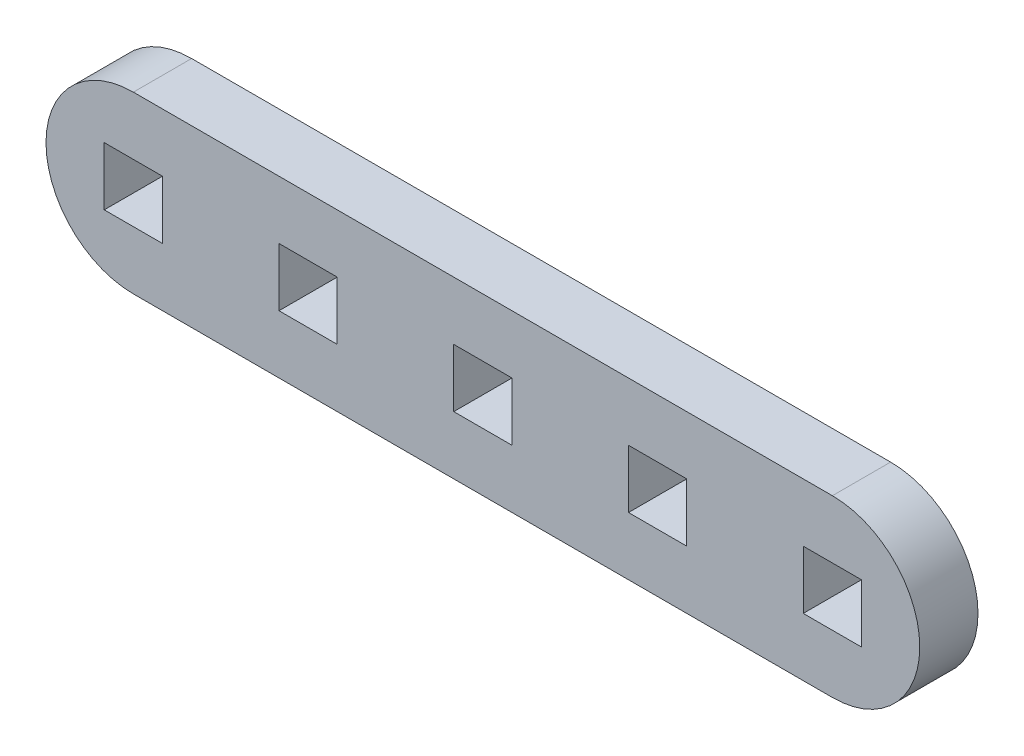
ISO-10303-21;
HEADER;
FILE_DESCRIPTION(('STEP AP214'),'2;1');
FILE_NAME('part.step','',(''),(''),'','','');
FILE_SCHEMA(('AUTOMOTIVE_DESIGN { 1 0 10303 214 1 1 1 1 }'));
ENDSEC;
DATA;
#1=APPLICATION_CONTEXT('core data for automotive mechanical design processes');
#2=APPLICATION_PROTOCOL_DEFINITION('international standard','automotive_design',2000,#1);
#3=PRODUCT_CONTEXT('',#1,'mechanical');
#4=PRODUCT('Part','Part','',(#3));
#5=PRODUCT_RELATED_PRODUCT_CATEGORY('part','',(#4));
#6=PRODUCT_DEFINITION_FORMATION('','',#4);
#7=PRODUCT_DEFINITION_CONTEXT('part definition',#1,'design');
#8=PRODUCT_DEFINITION('design','',#6,#7);
#9=PRODUCT_DEFINITION_SHAPE('','',#8);
#10=(LENGTH_UNIT() NAMED_UNIT(*) SI_UNIT(.MILLI.,.METRE.));
#11=(NAMED_UNIT(*) PLANE_ANGLE_UNIT() SI_UNIT($,.RADIAN.));
#12=(NAMED_UNIT(*) SI_UNIT($,.STERADIAN.) SOLID_ANGLE_UNIT());
#13=UNCERTAINTY_MEASURE_WITH_UNIT(LENGTH_MEASURE(1.E-05),#10,'distance_accuracy_value','');
#14=(GEOMETRIC_REPRESENTATION_CONTEXT(3) GLOBAL_UNCERTAINTY_ASSIGNED_CONTEXT((#13)) GLOBAL_UNIT_ASSIGNED_CONTEXT((#10,
#11,#12)) REPRESENTATION_CONTEXT('',''));
#15=CARTESIAN_POINT('',(0.,0.,0.));
#16=DIRECTION('',(0.,0.,1.));
#17=DIRECTION('',(1.,0.,0.));
#18=AXIS2_PLACEMENT_3D('',#15,#16,#17);
#19=CARTESIAN_POINT('',(47.4127492026,292.7399229362,3.));
#20=DIRECTION('',(0.,0.,1.));
#21=DIRECTION('',(1.,0.,0.));
#22=AXIS2_PLACEMENT_3D('',#19,#20,#21);
#23=PLANE('',#22);
#24=DIRECTION('',(0.,-1.,0.));
#25=VECTOR('',#24,1.);
#26=CARTESIAN_POINT('',(36.9127492026,294.2399229362,3.));
#27=LINE('',#26,#25);
#28=CARTESIAN_POINT('',(36.9127492026,294.2399229362,3.));
#29=VERTEX_POINT('',#28);
#30=CARTESIAN_POINT('',(36.9127492026,291.2399229362,3.));
#31=VERTEX_POINT('',#30);
#32=EDGE_CURVE('E232',#29,#31,#27,.T.);
#33=ORIENTED_EDGE('',*,*,#32,.F.);
#34=DIRECTION('',(-1.,0.,0.));
#35=VECTOR('',#34,1.);
#36=CARTESIAN_POINT('',(39.9127492026,294.2399229362,3.));
#37=LINE('',#36,#35);
#38=CARTESIAN_POINT('',(39.9127492026,294.2399229362,3.));
#39=VERTEX_POINT('',#38);
#40=EDGE_CURVE('E230',#39,#29,#37,.T.);
#41=ORIENTED_EDGE('',*,*,#40,.F.);
#42=DIRECTION('',(0.,1.,0.));
#43=VECTOR('',#42,1.);
#44=CARTESIAN_POINT('',(39.9127492026,291.2399229362,3.));
#45=LINE('',#44,#43);
#46=CARTESIAN_POINT('',(39.9127492026,291.2399229362,3.));
#47=VERTEX_POINT('',#46);
#48=EDGE_CURVE('E238',#47,#39,#45,.T.);
#49=ORIENTED_EDGE('',*,*,#48,.F.);
#50=DIRECTION('',(1.,0.,0.));
#51=VECTOR('',#50,1.);
#52=CARTESIAN_POINT('',(36.9127492026,291.2399229362,3.));
#53=LINE('',#52,#51);
#54=EDGE_CURVE('E235',#31,#47,#53,.T.);
#55=ORIENTED_EDGE('',*,*,#54,.F.);
#56=EDGE_LOOP('',(#33,#41,#49,#55));
#57=FACE_BOUND('',#56,.T.);
#58=DIRECTION('',(0.,-1.,0.));
#59=VECTOR('',#58,1.);
#60=CARTESIAN_POINT('',(18.9127492026,294.2399229362,3.));
#61=LINE('',#60,#59);
#62=CARTESIAN_POINT('',(18.9127492026,294.2399229362,3.));
#63=VERTEX_POINT('',#62);
#64=CARTESIAN_POINT('',(18.9127492026,291.2399229362,3.));
#65=VERTEX_POINT('',#64);
#66=EDGE_CURVE('E294',#63,#65,#61,.T.);
#67=ORIENTED_EDGE('',*,*,#66,.F.);
#68=DIRECTION('',(-1.,0.,0.));
#69=VECTOR('',#68,1.);
#70=CARTESIAN_POINT('',(21.9127492026,294.2399229362,3.));
#71=LINE('',#70,#69);
#72=CARTESIAN_POINT('',(21.9127492026,294.2399229362,3.));
#73=VERTEX_POINT('',#72);
#74=EDGE_CURVE('E292',#73,#63,#71,.T.);
#75=ORIENTED_EDGE('',*,*,#74,.F.);
#76=DIRECTION('',(0.,1.,0.));
#77=VECTOR('',#76,1.);
#78=CARTESIAN_POINT('',(21.9127492026,291.2399229362,3.));
#79=LINE('',#78,#77);
#80=CARTESIAN_POINT('',(21.9127492026,291.2399229362,3.));
#81=VERTEX_POINT('',#80);
#82=EDGE_CURVE('E300',#81,#73,#79,.T.);
#83=ORIENTED_EDGE('',*,*,#82,.F.);
#84=DIRECTION('',(1.,0.,0.));
#85=VECTOR('',#84,1.);
#86=CARTESIAN_POINT('',(18.9127492026,291.2399229362,3.));
#87=LINE('',#86,#85);
#88=EDGE_CURVE('E297',#65,#81,#87,.T.);
#89=ORIENTED_EDGE('',*,*,#88,.F.);
#90=EDGE_LOOP('',(#67,#75,#83,#89));
#91=FACE_BOUND('',#90,.T.);
#92=CARTESIAN_POINT('',(47.4127492026,292.7399229362,3.));
#93=DIRECTION('',(0.,0.,1.));
#94=DIRECTION('',(1.,0.,0.));
#95=AXIS2_PLACEMENT_3D('',#92,#93,#94);
#96=CIRCLE('',#95,4.5);
#97=CARTESIAN_POINT('',(47.4127492026,288.2399229362,3.));
#98=VERTEX_POINT('',#97);
#99=CARTESIAN_POINT('',(47.4127492026,297.2399229362,3.));
#100=VERTEX_POINT('',#99);
#101=EDGE_CURVE('E354',#98,#100,#96,.T.);
#102=ORIENTED_EDGE('',*,*,#101,.T.);
#103=DIRECTION('',(-1.,0.,0.));
#104=VECTOR('',#103,1.);
#105=CARTESIAN_POINT('',(11.4127492026,297.2399229362,3.));
#106=LINE('',#105,#104);
#107=CARTESIAN_POINT('',(11.4127492026,297.2399229362,3.));
#108=VERTEX_POINT('',#107);
#109=EDGE_CURVE('E357',#100,#108,#106,.T.);
#110=ORIENTED_EDGE('',*,*,#109,.T.);
#111=CARTESIAN_POINT('',(11.4127492026,292.7399229362,3.));
#112=DIRECTION('',(0.,0.,1.));
#113=DIRECTION('',(1.,0.,0.));
#114=AXIS2_PLACEMENT_3D('',#111,#112,#113);
#115=CIRCLE('',#114,4.5);
#116=CARTESIAN_POINT('',(11.4127492026,288.2399229362,3.));
#117=VERTEX_POINT('',#116);
#118=EDGE_CURVE('E360',#108,#117,#115,.T.);
#119=ORIENTED_EDGE('',*,*,#118,.T.);
#120=DIRECTION('',(1.,0.,0.));
#121=VECTOR('',#120,1.);
#122=CARTESIAN_POINT('',(11.4127492026,288.2399229362,3.));
#123=LINE('',#122,#121);
#124=EDGE_CURVE('E362',#117,#98,#123,.T.);
#125=ORIENTED_EDGE('',*,*,#124,.T.);
#126=EDGE_LOOP('',(#102,#110,#119,#125));
#127=FACE_BOUND('',#126,.T.);
#128=DIRECTION('',(0.,-1.,0.));
#129=VECTOR('',#128,1.);
#130=CARTESIAN_POINT('',(9.9127492026,294.2399229362,3.));
#131=LINE('',#130,#129);
#132=CARTESIAN_POINT('',(9.9127492026,294.2399229362,3.));
#133=VERTEX_POINT('',#132);
#134=CARTESIAN_POINT('',(9.9127492026,291.2399229362,3.));
#135=VERTEX_POINT('',#134);
#136=EDGE_CURVE('E325',#133,#135,#131,.T.);
#137=ORIENTED_EDGE('',*,*,#136,.F.);
#138=DIRECTION('',(-1.,0.,0.));
#139=VECTOR('',#138,1.);
#140=CARTESIAN_POINT('',(12.9127492026,294.2399229362,3.));
#141=LINE('',#140,#139);
#142=CARTESIAN_POINT('',(12.9127492026,294.2399229362,3.));
#143=VERTEX_POINT('',#142);
#144=EDGE_CURVE('E323',#143,#133,#141,.T.);
#145=ORIENTED_EDGE('',*,*,#144,.F.);
#146=DIRECTION('',(0.,1.,0.));
#147=VECTOR('',#146,1.);
#148=CARTESIAN_POINT('',(12.9127492026,291.2399229362,3.));
#149=LINE('',#148,#147);
#150=CARTESIAN_POINT('',(12.9127492026,291.2399229362,3.));
#151=VERTEX_POINT('',#150);
#152=EDGE_CURVE('E331',#151,#143,#149,.T.);
#153=ORIENTED_EDGE('',*,*,#152,.F.);
#154=DIRECTION('',(1.,0.,0.));
#155=VECTOR('',#154,1.);
#156=CARTESIAN_POINT('',(9.9127492026,291.2399229362,3.));
#157=LINE('',#156,#155);
#158=EDGE_CURVE('E328',#135,#151,#157,.T.);
#159=ORIENTED_EDGE('',*,*,#158,.F.);
#160=EDGE_LOOP('',(#137,#145,#153,#159));
#161=FACE_BOUND('',#160,.T.);
#162=DIRECTION('',(0.,-1.,0.));
#163=VECTOR('',#162,1.);
#164=CARTESIAN_POINT('',(27.9127492026,294.2399229362,3.));
#165=LINE('',#164,#163);
#166=CARTESIAN_POINT('',(27.9127492026,294.2399229362,3.));
#167=VERTEX_POINT('',#166);
#168=CARTESIAN_POINT('',(27.9127492026,291.2399229362,3.));
#169=VERTEX_POINT('',#168);
#170=EDGE_CURVE('E263',#167,#169,#165,.T.);
#171=ORIENTED_EDGE('',*,*,#170,.F.);
#172=DIRECTION('',(-1.,0.,0.));
#173=VECTOR('',#172,1.);
#174=CARTESIAN_POINT('',(30.9127492026,294.2399229362,3.));
#175=LINE('',#174,#173);
#176=CARTESIAN_POINT('',(30.9127492026,294.2399229362,3.));
#177=VERTEX_POINT('',#176);
#178=EDGE_CURVE('E261',#177,#167,#175,.T.);
#179=ORIENTED_EDGE('',*,*,#178,.F.);
#180=DIRECTION('',(0.,1.,0.));
#181=VECTOR('',#180,1.);
#182=CARTESIAN_POINT('',(30.9127492026,291.2399229362,3.));
#183=LINE('',#182,#181);
#184=CARTESIAN_POINT('',(30.9127492026,291.2399229362,3.));
#185=VERTEX_POINT('',#184);
#186=EDGE_CURVE('E269',#185,#177,#183,.T.);
#187=ORIENTED_EDGE('',*,*,#186,.F.);
#188=DIRECTION('',(1.,0.,0.));
#189=VECTOR('',#188,1.);
#190=CARTESIAN_POINT('',(27.9127492026,291.2399229362,3.));
#191=LINE('',#190,#189);
#192=EDGE_CURVE('E266',#169,#185,#191,.T.);
#193=ORIENTED_EDGE('',*,*,#192,.F.);
#194=EDGE_LOOP('',(#171,#179,#187,#193));
#195=FACE_BOUND('',#194,.T.);
#196=DIRECTION('',(0.,-1.,0.));
#197=VECTOR('',#196,1.);
#198=CARTESIAN_POINT('',(45.9127492026,294.2399229362,3.));
#199=LINE('',#198,#197);
#200=CARTESIAN_POINT('',(45.9127492026,294.2399229362,3.));
#201=VERTEX_POINT('',#200);
#202=CARTESIAN_POINT('',(45.9127492026,291.2399229362,3.));
#203=VERTEX_POINT('',#202);
#204=EDGE_CURVE('E202',#201,#203,#199,.T.);
#205=ORIENTED_EDGE('',*,*,#204,.F.);
#206=DIRECTION('',(-1.,0.,0.));
#207=VECTOR('',#206,1.);
#208=CARTESIAN_POINT('',(48.9127492026,294.2399229362,3.));
#209=LINE('',#208,#207);
#210=CARTESIAN_POINT('',(48.9127492026,294.2399229362,3.));
#211=VERTEX_POINT('',#210);
#212=EDGE_CURVE('E194',#211,#201,#209,.T.);
#213=ORIENTED_EDGE('',*,*,#212,.F.);
#214=DIRECTION('',(0.,1.,0.));
#215=VECTOR('',#214,1.);
#216=CARTESIAN_POINT('',(48.9127492026,291.2399229362,3.));
#217=LINE('',#216,#215);
#218=CARTESIAN_POINT('',(48.9127492026,291.2399229362,3.));
#219=VERTEX_POINT('',#218);
#220=EDGE_CURVE('E216',#219,#211,#217,.T.);
#221=ORIENTED_EDGE('',*,*,#220,.F.);
#222=DIRECTION('',(1.,0.,0.));
#223=VECTOR('',#222,1.);
#224=CARTESIAN_POINT('',(45.9127492026,291.2399229362,3.));
#225=LINE('',#224,#223);
#226=EDGE_CURVE('E214',#203,#219,#225,.T.);
#227=ORIENTED_EDGE('',*,*,#226,.F.);
#228=EDGE_LOOP('',(#205,#213,#221,#227));
#229=FACE_BOUND('',#228,.T.);
#230=ADVANCED_FACE('F33',(#57,#91,#127,#161,#195,#229),#23,.T.);
#231=CARTESIAN_POINT('',(47.4127492026,292.7399229362,0.));
#232=DIRECTION('',(0.,0.,1.));
#233=DIRECTION('',(1.,0.,0.));
#234=AXIS2_PLACEMENT_3D('',#231,#232,#233);
#235=PLANE('',#234);
#236=DIRECTION('',(-1.,0.,0.));
#237=VECTOR('',#236,1.);
#238=CARTESIAN_POINT('',(39.9127492026,294.2399229362,0.));
#239=LINE('',#238,#237);
#240=CARTESIAN_POINT('',(39.9127492026,294.2399229362,0.));
#241=VERTEX_POINT('',#240);
#242=CARTESIAN_POINT('',(36.9127492026,294.2399229362,0.));
#243=VERTEX_POINT('',#242);
#244=EDGE_CURVE('E210',#241,#243,#239,.T.);
#245=ORIENTED_EDGE('',*,*,#244,.T.);
#246=DIRECTION('',(0.,-1.,0.));
#247=VECTOR('',#246,1.);
#248=CARTESIAN_POINT('',(36.9127492026,294.2399229362,0.));
#249=LINE('',#248,#247);
#250=CARTESIAN_POINT('',(36.9127492026,291.2399229362,0.));
#251=VERTEX_POINT('',#250);
#252=EDGE_CURVE('E243',#243,#251,#249,.T.);
#253=ORIENTED_EDGE('',*,*,#252,.T.);
#254=DIRECTION('',(1.,0.,0.));
#255=VECTOR('',#254,1.);
#256=CARTESIAN_POINT('',(36.9127492026,291.2399229362,0.));
#257=LINE('',#256,#255);
#258=CARTESIAN_POINT('',(39.9127492026,291.2399229362,0.));
#259=VERTEX_POINT('',#258);
#260=EDGE_CURVE('E246',#251,#259,#257,.T.);
#261=ORIENTED_EDGE('',*,*,#260,.T.);
#262=DIRECTION('',(0.,1.,0.));
#263=VECTOR('',#262,1.);
#264=CARTESIAN_POINT('',(39.9127492026,291.2399229362,0.));
#265=LINE('',#264,#263);
#266=EDGE_CURVE('E233',#259,#241,#265,.T.);
#267=ORIENTED_EDGE('',*,*,#266,.T.);
#268=EDGE_LOOP('',(#245,#253,#261,#267));
#269=FACE_BOUND('',#268,.T.);
#270=DIRECTION('',(-1.,0.,0.));
#271=VECTOR('',#270,1.);
#272=CARTESIAN_POINT('',(21.9127492026,294.2399229362,0.));
#273=LINE('',#272,#271);
#274=CARTESIAN_POINT('',(21.9127492026,294.2399229362,0.));
#275=VERTEX_POINT('',#274);
#276=CARTESIAN_POINT('',(18.9127492026,294.2399229362,0.));
#277=VERTEX_POINT('',#276);
#278=EDGE_CURVE('E291',#275,#277,#273,.T.);
#279=ORIENTED_EDGE('',*,*,#278,.T.);
#280=DIRECTION('',(0.,-1.,0.));
#281=VECTOR('',#280,1.);
#282=CARTESIAN_POINT('',(18.9127492026,294.2399229362,0.));
#283=LINE('',#282,#281);
#284=CARTESIAN_POINT('',(18.9127492026,291.2399229362,0.));
#285=VERTEX_POINT('',#284);
#286=EDGE_CURVE('E305',#277,#285,#283,.T.);
#287=ORIENTED_EDGE('',*,*,#286,.T.);
#288=DIRECTION('',(1.,0.,0.));
#289=VECTOR('',#288,1.);
#290=CARTESIAN_POINT('',(18.9127492026,291.2399229362,0.));
#291=LINE('',#290,#289);
#292=CARTESIAN_POINT('',(21.9127492026,291.2399229362,0.));
#293=VERTEX_POINT('',#292);
#294=EDGE_CURVE('E308',#285,#293,#291,.T.);
#295=ORIENTED_EDGE('',*,*,#294,.T.);
#296=DIRECTION('',(0.,1.,0.));
#297=VECTOR('',#296,1.);
#298=CARTESIAN_POINT('',(21.9127492026,291.2399229362,0.));
#299=LINE('',#298,#297);
#300=EDGE_CURVE('E295',#293,#275,#299,.T.);
#301=ORIENTED_EDGE('',*,*,#300,.T.);
#302=EDGE_LOOP('',(#279,#287,#295,#301));
#303=FACE_BOUND('',#302,.T.);
#304=CARTESIAN_POINT('',(47.4127492026,292.7399229362,0.));
#305=DIRECTION('',(0.,0.,1.));
#306=DIRECTION('',(1.,0.,0.));
#307=AXIS2_PLACEMENT_3D('',#304,#305,#306);
#308=CIRCLE('',#307,4.5);
#309=CARTESIAN_POINT('',(47.4127492026,288.2399229362,0.));
#310=VERTEX_POINT('',#309);
#311=CARTESIAN_POINT('',(47.4127492026,297.2399229362,0.));
#312=VERTEX_POINT('',#311);
#313=EDGE_CURVE('E353',#310,#312,#308,.T.);
#314=ORIENTED_EDGE('',*,*,#313,.F.);
#315=DIRECTION('',(1.,0.,0.));
#316=VECTOR('',#315,1.);
#317=CARTESIAN_POINT('',(11.4127492026,288.2399229362,0.));
#318=LINE('',#317,#316);
#319=CARTESIAN_POINT('',(11.4127492026,288.2399229362,0.));
#320=VERTEX_POINT('',#319);
#321=EDGE_CURVE('E358',#320,#310,#318,.T.);
#322=ORIENTED_EDGE('',*,*,#321,.F.);
#323=CARTESIAN_POINT('',(11.4127492026,292.7399229362,0.));
#324=DIRECTION('',(0.,0.,1.));
#325=DIRECTION('',(1.,0.,0.));
#326=AXIS2_PLACEMENT_3D('',#323,#324,#325);
#327=CIRCLE('',#326,4.5);
#328=CARTESIAN_POINT('',(11.4127492026,297.2399229362,0.));
#329=VERTEX_POINT('',#328);
#330=EDGE_CURVE('E369',#329,#320,#327,.T.);
#331=ORIENTED_EDGE('',*,*,#330,.F.);
#332=DIRECTION('',(-1.,0.,0.));
#333=VECTOR('',#332,1.);
#334=CARTESIAN_POINT('',(11.4127492026,297.2399229362,0.));
#335=LINE('',#334,#333);
#336=EDGE_CURVE('E367',#312,#329,#335,.T.);
#337=ORIENTED_EDGE('',*,*,#336,.F.);
#338=EDGE_LOOP('',(#314,#322,#331,#337));
#339=FACE_BOUND('',#338,.T.);
#340=DIRECTION('',(-1.,0.,0.));
#341=VECTOR('',#340,1.);
#342=CARTESIAN_POINT('',(12.9127492026,294.2399229362,0.));
#343=LINE('',#342,#341);
#344=CARTESIAN_POINT('',(12.9127492026,294.2399229362,0.));
#345=VERTEX_POINT('',#344);
#346=CARTESIAN_POINT('',(9.9127492026,294.2399229362,0.));
#347=VERTEX_POINT('',#346);
#348=EDGE_CURVE('E322',#345,#347,#343,.T.);
#349=ORIENTED_EDGE('',*,*,#348,.T.);
#350=DIRECTION('',(0.,-1.,0.));
#351=VECTOR('',#350,1.);
#352=CARTESIAN_POINT('',(9.9127492026,294.2399229362,0.));
#353=LINE('',#352,#351);
#354=CARTESIAN_POINT('',(9.9127492026,291.2399229362,0.));
#355=VERTEX_POINT('',#354);
#356=EDGE_CURVE('E336',#347,#355,#353,.T.);
#357=ORIENTED_EDGE('',*,*,#356,.T.);
#358=DIRECTION('',(1.,0.,0.));
#359=VECTOR('',#358,1.);
#360=CARTESIAN_POINT('',(9.9127492026,291.2399229362,0.));
#361=LINE('',#360,#359);
#362=CARTESIAN_POINT('',(12.9127492026,291.2399229362,0.));
#363=VERTEX_POINT('',#362);
#364=EDGE_CURVE('E339',#355,#363,#361,.T.);
#365=ORIENTED_EDGE('',*,*,#364,.T.);
#366=DIRECTION('',(0.,1.,0.));
#367=VECTOR('',#366,1.);
#368=CARTESIAN_POINT('',(12.9127492026,291.2399229362,0.));
#369=LINE('',#368,#367);
#370=EDGE_CURVE('E326',#363,#345,#369,.T.);
#371=ORIENTED_EDGE('',*,*,#370,.T.);
#372=EDGE_LOOP('',(#349,#357,#365,#371));
#373=FACE_BOUND('',#372,.T.);
#374=DIRECTION('',(-1.,0.,0.));
#375=VECTOR('',#374,1.);
#376=CARTESIAN_POINT('',(30.9127492026,294.2399229362,0.));
#377=LINE('',#376,#375);
#378=CARTESIAN_POINT('',(30.9127492026,294.2399229362,0.));
#379=VERTEX_POINT('',#378);
#380=CARTESIAN_POINT('',(27.9127492026,294.2399229362,0.));
#381=VERTEX_POINT('',#380);
#382=EDGE_CURVE('E260',#379,#381,#377,.T.);
#383=ORIENTED_EDGE('',*,*,#382,.T.);
#384=DIRECTION('',(0.,-1.,0.));
#385=VECTOR('',#384,1.);
#386=CARTESIAN_POINT('',(27.9127492026,294.2399229362,0.));
#387=LINE('',#386,#385);
#388=CARTESIAN_POINT('',(27.9127492026,291.2399229362,0.));
#389=VERTEX_POINT('',#388);
#390=EDGE_CURVE('E274',#381,#389,#387,.T.);
#391=ORIENTED_EDGE('',*,*,#390,.T.);
#392=DIRECTION('',(1.,0.,0.));
#393=VECTOR('',#392,1.);
#394=CARTESIAN_POINT('',(27.9127492026,291.2399229362,0.));
#395=LINE('',#394,#393);
#396=CARTESIAN_POINT('',(30.9127492026,291.2399229362,0.));
#397=VERTEX_POINT('',#396);
#398=EDGE_CURVE('E277',#389,#397,#395,.T.);
#399=ORIENTED_EDGE('',*,*,#398,.T.);
#400=DIRECTION('',(0.,1.,0.));
#401=VECTOR('',#400,1.);
#402=CARTESIAN_POINT('',(30.9127492026,291.2399229362,0.));
#403=LINE('',#402,#401);
#404=EDGE_CURVE('E264',#397,#379,#403,.T.);
#405=ORIENTED_EDGE('',*,*,#404,.T.);
#406=EDGE_LOOP('',(#383,#391,#399,#405));
#407=FACE_BOUND('',#406,.T.);
#408=DIRECTION('',(-1.,0.,0.));
#409=VECTOR('',#408,1.);
#410=CARTESIAN_POINT('',(48.9127492026,294.2399229362,0.));
#411=LINE('',#410,#409);
#412=CARTESIAN_POINT('',(48.9127492026,294.2399229362,0.));
#413=VERTEX_POINT('',#412);
#414=CARTESIAN_POINT('',(45.9127492026,294.2399229362,0.));
#415=VERTEX_POINT('',#414);
#416=EDGE_CURVE('E56',#413,#415,#411,.T.);
#417=ORIENTED_EDGE('',*,*,#416,.T.);
#418=DIRECTION('',(0.,-1.,0.));
#419=VECTOR('',#418,1.);
#420=CARTESIAN_POINT('',(45.9127492026,294.2399229362,0.));
#421=LINE('',#420,#419);
#422=CARTESIAN_POINT('',(45.9127492026,291.2399229362,0.));
#423=VERTEX_POINT('',#422);
#424=EDGE_CURVE('E209',#415,#423,#421,.T.);
#425=ORIENTED_EDGE('',*,*,#424,.T.);
#426=DIRECTION('',(1.,0.,0.));
#427=VECTOR('',#426,1.);
#428=CARTESIAN_POINT('',(45.9127492026,291.2399229362,0.));
#429=LINE('',#428,#427);
#430=CARTESIAN_POINT('',(48.9127492026,291.2399229362,0.));
#431=VERTEX_POINT('',#430);
#432=EDGE_CURVE('E222',#423,#431,#429,.T.);
#433=ORIENTED_EDGE('',*,*,#432,.T.);
#434=DIRECTION('',(0.,1.,0.));
#435=VECTOR('',#434,1.);
#436=CARTESIAN_POINT('',(48.9127492026,291.2399229362,0.));
#437=LINE('',#436,#435);
#438=EDGE_CURVE('E203',#431,#413,#437,.T.);
#439=ORIENTED_EDGE('',*,*,#438,.T.);
#440=EDGE_LOOP('',(#417,#425,#433,#439));
#441=FACE_BOUND('',#440,.T.);
#442=ADVANCED_FACE('F387',(#269,#303,#339,#373,#407,#441),#235,.F.);
#443=CARTESIAN_POINT('',(47.4127492026,292.7399229362,3.));
#444=DIRECTION('',(0.,0.,-1.));
#445=DIRECTION('',(-1.,0.,0.));
#446=AXIS2_PLACEMENT_3D('',#443,#444,#445);
#447=CYLINDRICAL_SURFACE('',#446,4.5);
#448=ORIENTED_EDGE('',*,*,#313,.T.);
#449=DIRECTION('',(0.,0.,-1.));
#450=VECTOR('',#449,1.);
#451=CARTESIAN_POINT('',(47.4127492026,297.2399229362,3.));
#452=LINE('',#451,#450);
#453=EDGE_CURVE('E11',#100,#312,#452,.T.);
#454=ORIENTED_EDGE('',*,*,#453,.F.);
#455=ORIENTED_EDGE('',*,*,#101,.F.);
#456=DIRECTION('',(0.,0.,-1.));
#457=VECTOR('',#456,1.);
#458=CARTESIAN_POINT('',(47.4127492026,288.2399229362,3.));
#459=LINE('',#458,#457);
#460=EDGE_CURVE('E364',#98,#310,#459,.T.);
#461=ORIENTED_EDGE('',*,*,#460,.T.);
#462=EDGE_LOOP('',(#448,#454,#455,#461));
#463=FACE_BOUND('',#462,.T.);
#464=ADVANCED_FACE('F35',(#463),#447,.T.);
#465=CARTESIAN_POINT('',(11.4127492026,297.2399229362,3.));
#466=DIRECTION('',(0.,-1.,0.));
#467=DIRECTION('',(0.,0.,-1.));
#468=AXIS2_PLACEMENT_3D('',#465,#466,#467);
#469=PLANE('',#468);
#470=ORIENTED_EDGE('',*,*,#336,.T.);
#471=DIRECTION('',(0.,0.,-1.));
#472=VECTOR('',#471,1.);
#473=CARTESIAN_POINT('',(11.4127492026,297.2399229362,3.));
#474=LINE('',#473,#472);
#475=EDGE_CURVE('E41',#108,#329,#474,.T.);
#476=ORIENTED_EDGE('',*,*,#475,.F.);
#477=ORIENTED_EDGE('',*,*,#109,.F.);
#478=ORIENTED_EDGE('',*,*,#453,.T.);
#479=EDGE_LOOP('',(#470,#476,#477,#478));
#480=FACE_BOUND('',#479,.T.);
#481=ADVANCED_FACE('F398',(#480),#469,.F.);
#482=CARTESIAN_POINT('',(11.4127492026,292.7399229362,3.));
#483=DIRECTION('',(0.,0.,-1.));
#484=DIRECTION('',(-1.,0.,0.));
#485=AXIS2_PLACEMENT_3D('',#482,#483,#484);
#486=CYLINDRICAL_SURFACE('',#485,4.5);
#487=ORIENTED_EDGE('',*,*,#330,.T.);
#488=DIRECTION('',(0.,0.,-1.));
#489=VECTOR('',#488,1.);
#490=CARTESIAN_POINT('',(11.4127492026,288.2399229362,3.));
#491=LINE('',#490,#489);
#492=EDGE_CURVE('E374',#117,#320,#491,.T.);
#493=ORIENTED_EDGE('',*,*,#492,.F.);
#494=ORIENTED_EDGE('',*,*,#118,.F.);
#495=ORIENTED_EDGE('',*,*,#475,.T.);
#496=EDGE_LOOP('',(#487,#493,#494,#495));
#497=FACE_BOUND('',#496,.T.);
#498=ADVANCED_FACE('F381',(#497),#486,.T.);
#499=CARTESIAN_POINT('',(11.4127492026,288.2399229362,3.));
#500=DIRECTION('',(0.,1.,0.));
#501=DIRECTION('',(0.,0.,1.));
#502=AXIS2_PLACEMENT_3D('',#499,#500,#501);
#503=PLANE('',#502);
#504=ORIENTED_EDGE('',*,*,#321,.T.);
#505=ORIENTED_EDGE('',*,*,#460,.F.);
#506=ORIENTED_EDGE('',*,*,#124,.F.);
#507=ORIENTED_EDGE('',*,*,#492,.T.);
#508=EDGE_LOOP('',(#504,#505,#506,#507));
#509=FACE_BOUND('',#508,.T.);
#510=ADVANCED_FACE('F391',(#509),#503,.F.);
#511=CARTESIAN_POINT('',(12.9127492026,294.2399229362,3.));
#512=DIRECTION('',(0.,-1.,0.));
#513=DIRECTION('',(0.,0.,-1.));
#514=AXIS2_PLACEMENT_3D('',#511,#512,#513);
#515=PLANE('',#514);
#516=ORIENTED_EDGE('',*,*,#348,.F.);
#517=DIRECTION('',(0.,0.,-1.));
#518=VECTOR('',#517,1.);
#519=CARTESIAN_POINT('',(12.9127492026,294.2399229362,3.));
#520=LINE('',#519,#518);
#521=EDGE_CURVE('E333',#143,#345,#520,.T.);
#522=ORIENTED_EDGE('',*,*,#521,.F.);
#523=ORIENTED_EDGE('',*,*,#144,.T.);
#524=DIRECTION('',(0.,0.,-1.));
#525=VECTOR('',#524,1.);
#526=CARTESIAN_POINT('',(9.9127492026,294.2399229362,3.));
#527=LINE('',#526,#525);
#528=EDGE_CURVE('E350',#133,#347,#527,.T.);
#529=ORIENTED_EDGE('',*,*,#528,.T.);
#530=EDGE_LOOP('',(#516,#522,#523,#529));
#531=FACE_BOUND('',#530,.T.);
#532=ADVANCED_FACE('F416',(#531),#515,.T.);
#533=CARTESIAN_POINT('',(9.9127492026,294.2399229362,3.));
#534=DIRECTION('',(1.,0.,0.));
#535=DIRECTION('',(0.,0.,-1.));
#536=AXIS2_PLACEMENT_3D('',#533,#534,#535);
#537=PLANE('',#536);
#538=ORIENTED_EDGE('',*,*,#356,.F.);
#539=ORIENTED_EDGE('',*,*,#528,.F.);
#540=ORIENTED_EDGE('',*,*,#136,.T.);
#541=DIRECTION('',(0.,0.,-1.));
#542=VECTOR('',#541,1.);
#543=CARTESIAN_POINT('',(9.9127492026,291.2399229362,3.));
#544=LINE('',#543,#542);
#545=EDGE_CURVE('E348',#135,#355,#544,.T.);
#546=ORIENTED_EDGE('',*,*,#545,.T.);
#547=EDGE_LOOP('',(#538,#539,#540,#546));
#548=FACE_BOUND('',#547,.T.);
#549=ADVANCED_FACE('F423',(#548),#537,.T.);
#550=CARTESIAN_POINT('',(9.9127492026,291.2399229362,3.));
#551=DIRECTION('',(0.,1.,0.));
#552=DIRECTION('',(0.,0.,1.));
#553=AXIS2_PLACEMENT_3D('',#550,#551,#552);
#554=PLANE('',#553);
#555=ORIENTED_EDGE('',*,*,#364,.F.);
#556=ORIENTED_EDGE('',*,*,#545,.F.);
#557=ORIENTED_EDGE('',*,*,#158,.T.);
#558=DIRECTION('',(0.,0.,-1.));
#559=VECTOR('',#558,1.);
#560=CARTESIAN_POINT('',(12.9127492026,291.2399229362,3.));
#561=LINE('',#560,#559);
#562=EDGE_CURVE('E346',#151,#363,#561,.T.);
#563=ORIENTED_EDGE('',*,*,#562,.T.);
#564=EDGE_LOOP('',(#555,#556,#557,#563));
#565=FACE_BOUND('',#564,.T.);
#566=ADVANCED_FACE('F428',(#565),#554,.T.);
#567=CARTESIAN_POINT('',(12.9127492026,291.2399229362,3.));
#568=DIRECTION('',(-1.,0.,0.));
#569=DIRECTION('',(0.,0.,1.));
#570=AXIS2_PLACEMENT_3D('',#567,#568,#569);
#571=PLANE('',#570);
#572=ORIENTED_EDGE('',*,*,#370,.F.);
#573=ORIENTED_EDGE('',*,*,#562,.F.);
#574=ORIENTED_EDGE('',*,*,#152,.T.);
#575=ORIENTED_EDGE('',*,*,#521,.T.);
#576=EDGE_LOOP('',(#572,#573,#574,#575));
#577=FACE_BOUND('',#576,.T.);
#578=ADVANCED_FACE('F435',(#577),#571,.T.);
#579=CARTESIAN_POINT('',(21.9127492026,294.2399229362,3.));
#580=DIRECTION('',(0.,-1.,0.));
#581=DIRECTION('',(0.,0.,-1.));
#582=AXIS2_PLACEMENT_3D('',#579,#580,#581);
#583=PLANE('',#582);
#584=ORIENTED_EDGE('',*,*,#278,.F.);
#585=DIRECTION('',(0.,0.,-1.));
#586=VECTOR('',#585,1.);
#587=CARTESIAN_POINT('',(21.9127492026,294.2399229362,3.));
#588=LINE('',#587,#586);
#589=EDGE_CURVE('E302',#73,#275,#588,.T.);
#590=ORIENTED_EDGE('',*,*,#589,.F.);
#591=ORIENTED_EDGE('',*,*,#74,.T.);
#592=DIRECTION('',(0.,0.,-1.));
#593=VECTOR('',#592,1.);
#594=CARTESIAN_POINT('',(18.9127492026,294.2399229362,3.));
#595=LINE('',#594,#593);
#596=EDGE_CURVE('E319',#63,#277,#595,.T.);
#597=ORIENTED_EDGE('',*,*,#596,.T.);
#598=EDGE_LOOP('',(#584,#590,#591,#597));
#599=FACE_BOUND('',#598,.T.);
#600=ADVANCED_FACE('F490',(#599),#583,.T.);
#601=CARTESIAN_POINT('',(18.9127492026,294.2399229362,3.));
#602=DIRECTION('',(1.,0.,0.));
#603=DIRECTION('',(0.,0.,-1.));
#604=AXIS2_PLACEMENT_3D('',#601,#602,#603);
#605=PLANE('',#604);
#606=ORIENTED_EDGE('',*,*,#286,.F.);
#607=ORIENTED_EDGE('',*,*,#596,.F.);
#608=ORIENTED_EDGE('',*,*,#66,.T.);
#609=DIRECTION('',(0.,0.,-1.));
#610=VECTOR('',#609,1.);
#611=CARTESIAN_POINT('',(18.9127492026,291.2399229362,3.));
#612=LINE('',#611,#610);
#613=EDGE_CURVE('E317',#65,#285,#612,.T.);
#614=ORIENTED_EDGE('',*,*,#613,.T.);
#615=EDGE_LOOP('',(#606,#607,#608,#614));
#616=FACE_BOUND('',#615,.T.);
#617=ADVANCED_FACE('F486',(#616),#605,.T.);
#618=CARTESIAN_POINT('',(18.9127492026,291.2399229362,3.));
#619=DIRECTION('',(0.,1.,0.));
#620=DIRECTION('',(0.,0.,1.));
#621=AXIS2_PLACEMENT_3D('',#618,#619,#620);
#622=PLANE('',#621);
#623=ORIENTED_EDGE('',*,*,#294,.F.);
#624=ORIENTED_EDGE('',*,*,#613,.F.);
#625=ORIENTED_EDGE('',*,*,#88,.T.);
#626=DIRECTION('',(0.,0.,-1.));
#627=VECTOR('',#626,1.);
#628=CARTESIAN_POINT('',(21.9127492026,291.2399229362,3.));
#629=LINE('',#628,#627);
#630=EDGE_CURVE('E315',#81,#293,#629,.T.);
#631=ORIENTED_EDGE('',*,*,#630,.T.);
#632=EDGE_LOOP('',(#623,#624,#625,#631));
#633=FACE_BOUND('',#632,.T.);
#634=ADVANCED_FACE('F482',(#633),#622,.T.);
#635=CARTESIAN_POINT('',(21.9127492026,291.2399229362,3.));
#636=DIRECTION('',(-1.,0.,0.));
#637=DIRECTION('',(0.,0.,1.));
#638=AXIS2_PLACEMENT_3D('',#635,#636,#637);
#639=PLANE('',#638);
#640=ORIENTED_EDGE('',*,*,#300,.F.);
#641=ORIENTED_EDGE('',*,*,#630,.F.);
#642=ORIENTED_EDGE('',*,*,#82,.T.);
#643=ORIENTED_EDGE('',*,*,#589,.T.);
#644=EDGE_LOOP('',(#640,#641,#642,#643));
#645=FACE_BOUND('',#644,.T.);
#646=ADVANCED_FACE('F479',(#645),#639,.T.);
#647=CARTESIAN_POINT('',(30.9127492026,294.2399229362,3.));
#648=DIRECTION('',(0.,-1.,0.));
#649=DIRECTION('',(0.,0.,-1.));
#650=AXIS2_PLACEMENT_3D('',#647,#648,#649);
#651=PLANE('',#650);
#652=ORIENTED_EDGE('',*,*,#382,.F.);
#653=DIRECTION('',(0.,0.,-1.));
#654=VECTOR('',#653,1.);
#655=CARTESIAN_POINT('',(30.9127492026,294.2399229362,3.));
#656=LINE('',#655,#654);
#657=EDGE_CURVE('E271',#177,#379,#656,.T.);
#658=ORIENTED_EDGE('',*,*,#657,.F.);
#659=ORIENTED_EDGE('',*,*,#178,.T.);
#660=DIRECTION('',(0.,0.,-1.));
#661=VECTOR('',#660,1.);
#662=CARTESIAN_POINT('',(27.9127492026,294.2399229362,3.));
#663=LINE('',#662,#661);
#664=EDGE_CURVE('E288',#167,#381,#663,.T.);
#665=ORIENTED_EDGE('',*,*,#664,.T.);
#666=EDGE_LOOP('',(#652,#658,#659,#665));
#667=FACE_BOUND('',#666,.T.);
#668=ADVANCED_FACE('F458',(#667),#651,.T.);
#669=CARTESIAN_POINT('',(27.9127492026,294.2399229362,3.));
#670=DIRECTION('',(1.,0.,0.));
#671=DIRECTION('',(0.,0.,-1.));
#672=AXIS2_PLACEMENT_3D('',#669,#670,#671);
#673=PLANE('',#672);
#674=ORIENTED_EDGE('',*,*,#390,.F.);
#675=ORIENTED_EDGE('',*,*,#664,.F.);
#676=ORIENTED_EDGE('',*,*,#170,.T.);
#677=DIRECTION('',(0.,0.,-1.));
#678=VECTOR('',#677,1.);
#679=CARTESIAN_POINT('',(27.9127492026,291.2399229362,3.));
#680=LINE('',#679,#678);
#681=EDGE_CURVE('E286',#169,#389,#680,.T.);
#682=ORIENTED_EDGE('',*,*,#681,.T.);
#683=EDGE_LOOP('',(#674,#675,#676,#682));
#684=FACE_BOUND('',#683,.T.);
#685=ADVANCED_FACE('F451',(#684),#673,.T.);
#686=CARTESIAN_POINT('',(27.9127492026,291.2399229362,3.));
#687=DIRECTION('',(0.,1.,0.));
#688=DIRECTION('',(0.,0.,1.));
#689=AXIS2_PLACEMENT_3D('',#686,#687,#688);
#690=PLANE('',#689);
#691=ORIENTED_EDGE('',*,*,#398,.F.);
#692=ORIENTED_EDGE('',*,*,#681,.F.);
#693=ORIENTED_EDGE('',*,*,#192,.T.);
#694=DIRECTION('',(0.,0.,-1.));
#695=VECTOR('',#694,1.);
#696=CARTESIAN_POINT('',(30.9127492026,291.2399229362,3.));
#697=LINE('',#696,#695);
#698=EDGE_CURVE('E284',#185,#397,#697,.T.);
#699=ORIENTED_EDGE('',*,*,#698,.T.);
#700=EDGE_LOOP('',(#691,#692,#693,#699));
#701=FACE_BOUND('',#700,.T.);
#702=ADVANCED_FACE('F454',(#701),#690,.T.);
#703=CARTESIAN_POINT('',(30.9127492026,291.2399229362,3.));
#704=DIRECTION('',(-1.,0.,0.));
#705=DIRECTION('',(0.,0.,1.));
#706=AXIS2_PLACEMENT_3D('',#703,#704,#705);
#707=PLANE('',#706);
#708=ORIENTED_EDGE('',*,*,#404,.F.);
#709=ORIENTED_EDGE('',*,*,#698,.F.);
#710=ORIENTED_EDGE('',*,*,#186,.T.);
#711=ORIENTED_EDGE('',*,*,#657,.T.);
#712=EDGE_LOOP('',(#708,#709,#710,#711));
#713=FACE_BOUND('',#712,.T.);
#714=ADVANCED_FACE('F461',(#713),#707,.T.);
#715=CARTESIAN_POINT('',(39.9127492026,294.2399229362,3.));
#716=DIRECTION('',(0.,-1.,0.));
#717=DIRECTION('',(0.,0.,-1.));
#718=AXIS2_PLACEMENT_3D('',#715,#716,#717);
#719=PLANE('',#718);
#720=ORIENTED_EDGE('',*,*,#244,.F.);
#721=DIRECTION('',(0.,0.,-1.));
#722=VECTOR('',#721,1.);
#723=CARTESIAN_POINT('',(39.9127492026,294.2399229362,3.));
#724=LINE('',#723,#722);
#725=EDGE_CURVE('E240',#39,#241,#724,.T.);
#726=ORIENTED_EDGE('',*,*,#725,.F.);
#727=ORIENTED_EDGE('',*,*,#40,.T.);
#728=DIRECTION('',(0.,0.,-1.));
#729=VECTOR('',#728,1.);
#730=CARTESIAN_POINT('',(36.9127492026,294.2399229362,3.));
#731=LINE('',#730,#729);
#732=EDGE_CURVE('E257',#29,#243,#731,.T.);
#733=ORIENTED_EDGE('',*,*,#732,.T.);
#734=EDGE_LOOP('',(#720,#726,#727,#733));
#735=FACE_BOUND('',#734,.T.);
#736=ADVANCED_FACE('F463',(#735),#719,.T.);
#737=CARTESIAN_POINT('',(36.9127492026,294.2399229362,3.));
#738=DIRECTION('',(1.,0.,0.));
#739=DIRECTION('',(0.,0.,-1.));
#740=AXIS2_PLACEMENT_3D('',#737,#738,#739);
#741=PLANE('',#740);
#742=ORIENTED_EDGE('',*,*,#252,.F.);
#743=ORIENTED_EDGE('',*,*,#732,.F.);
#744=ORIENTED_EDGE('',*,*,#32,.T.);
#745=DIRECTION('',(0.,0.,-1.));
#746=VECTOR('',#745,1.);
#747=CARTESIAN_POINT('',(36.9127492026,291.2399229362,3.));
#748=LINE('',#747,#746);
#749=EDGE_CURVE('E255',#31,#251,#748,.T.);
#750=ORIENTED_EDGE('',*,*,#749,.T.);
#751=EDGE_LOOP('',(#742,#743,#744,#750));
#752=FACE_BOUND('',#751,.T.);
#753=ADVANCED_FACE('F469',(#752),#741,.T.);
#754=CARTESIAN_POINT('',(36.9127492026,291.2399229362,3.));
#755=DIRECTION('',(0.,1.,0.));
#756=DIRECTION('',(0.,0.,1.));
#757=AXIS2_PLACEMENT_3D('',#754,#755,#756);
#758=PLANE('',#757);
#759=ORIENTED_EDGE('',*,*,#260,.F.);
#760=ORIENTED_EDGE('',*,*,#749,.F.);
#761=ORIENTED_EDGE('',*,*,#54,.T.);
#762=DIRECTION('',(0.,0.,-1.));
#763=VECTOR('',#762,1.);
#764=CARTESIAN_POINT('',(39.9127492026,291.2399229362,3.));
#765=LINE('',#764,#763);
#766=EDGE_CURVE('E253',#47,#259,#765,.T.);
#767=ORIENTED_EDGE('',*,*,#766,.T.);
#768=EDGE_LOOP('',(#759,#760,#761,#767));
#769=FACE_BOUND('',#768,.T.);
#770=ADVANCED_FACE('F553',(#769),#758,.T.);
#771=CARTESIAN_POINT('',(39.9127492026,291.2399229362,3.));
#772=DIRECTION('',(-1.,0.,0.));
#773=DIRECTION('',(0.,0.,1.));
#774=AXIS2_PLACEMENT_3D('',#771,#772,#773);
#775=PLANE('',#774);
#776=ORIENTED_EDGE('',*,*,#266,.F.);
#777=ORIENTED_EDGE('',*,*,#766,.F.);
#778=ORIENTED_EDGE('',*,*,#48,.T.);
#779=ORIENTED_EDGE('',*,*,#725,.T.);
#780=EDGE_LOOP('',(#776,#777,#778,#779));
#781=FACE_BOUND('',#780,.T.);
#782=ADVANCED_FACE('F562',(#781),#775,.T.);
#783=CARTESIAN_POINT('',(48.9127492026,294.2399229362,3.));
#784=DIRECTION('',(0.,-1.,0.));
#785=DIRECTION('',(0.,0.,-1.));
#786=AXIS2_PLACEMENT_3D('',#783,#784,#785);
#787=PLANE('',#786);
#788=ORIENTED_EDGE('',*,*,#416,.F.);
#789=DIRECTION('',(0.,0.,-1.));
#790=VECTOR('',#789,1.);
#791=CARTESIAN_POINT('',(48.9127492026,294.2399229362,3.));
#792=LINE('',#791,#790);
#793=EDGE_CURVE('E198',#211,#413,#792,.T.);
#794=ORIENTED_EDGE('',*,*,#793,.F.);
#795=ORIENTED_EDGE('',*,*,#212,.T.);
#796=DIRECTION('',(0.,0.,-1.));
#797=VECTOR('',#796,1.);
#798=CARTESIAN_POINT('',(45.9127492026,294.2399229362,3.));
#799=LINE('',#798,#797);
#800=EDGE_CURVE('E197',#201,#415,#799,.T.);
#801=ORIENTED_EDGE('',*,*,#800,.T.);
#802=EDGE_LOOP('',(#788,#794,#795,#801));
#803=FACE_BOUND('',#802,.T.);
#804=ADVANCED_FACE('F196',(#803),#787,.T.);
#805=CARTESIAN_POINT('',(45.9127492026,294.2399229362,3.));
#806=DIRECTION('',(1.,0.,0.));
#807=DIRECTION('',(0.,0.,-1.));
#808=AXIS2_PLACEMENT_3D('',#805,#806,#807);
#809=PLANE('',#808);
#810=ORIENTED_EDGE('',*,*,#424,.F.);
#811=ORIENTED_EDGE('',*,*,#800,.F.);
#812=ORIENTED_EDGE('',*,*,#204,.T.);
#813=DIRECTION('',(0.,0.,-1.));
#814=VECTOR('',#813,1.);
#815=CARTESIAN_POINT('',(45.9127492026,291.2399229362,3.));
#816=LINE('',#815,#814);
#817=EDGE_CURVE('E211',#203,#423,#816,.T.);
#818=ORIENTED_EDGE('',*,*,#817,.T.);
#819=EDGE_LOOP('',(#810,#811,#812,#818));
#820=FACE_BOUND('',#819,.T.);
#821=ADVANCED_FACE('F206',(#820),#809,.T.);
#822=CARTESIAN_POINT('',(45.9127492026,291.2399229362,3.));
#823=DIRECTION('',(0.,1.,0.));
#824=DIRECTION('',(0.,0.,1.));
#825=AXIS2_PLACEMENT_3D('',#822,#823,#824);
#826=PLANE('',#825);
#827=ORIENTED_EDGE('',*,*,#432,.F.);
#828=ORIENTED_EDGE('',*,*,#817,.F.);
#829=ORIENTED_EDGE('',*,*,#226,.T.);
#830=DIRECTION('',(0.,0.,-1.));
#831=VECTOR('',#830,1.);
#832=CARTESIAN_POINT('',(48.9127492026,291.2399229362,3.));
#833=LINE('',#832,#831);
#834=EDGE_CURVE('E48',#219,#431,#833,.T.);
#835=ORIENTED_EDGE('',*,*,#834,.T.);
#836=EDGE_LOOP('',(#827,#828,#829,#835));
#837=FACE_BOUND('',#836,.T.);
#838=ADVANCED_FACE('F589',(#837),#826,.T.);
#839=CARTESIAN_POINT('',(48.9127492026,291.2399229362,3.));
#840=DIRECTION('',(-1.,0.,0.));
#841=DIRECTION('',(0.,0.,1.));
#842=AXIS2_PLACEMENT_3D('',#839,#840,#841);
#843=PLANE('',#842);
#844=ORIENTED_EDGE('',*,*,#438,.F.);
#845=ORIENTED_EDGE('',*,*,#834,.F.);
#846=ORIENTED_EDGE('',*,*,#220,.T.);
#847=ORIENTED_EDGE('',*,*,#793,.T.);
#848=EDGE_LOOP('',(#844,#845,#846,#847));
#849=FACE_BOUND('',#848,.T.);
#850=ADVANCED_FACE('F598',(#849),#843,.T.);
#851=CLOSED_SHELL('',(#230,#442,#464,#481,#498,#510,#532,#549,#566,#578,#600,#617,#634,#646,
#668,#685,#702,#714,#736,#753,#770,#782,#804,#821,#838,#850));
#852=MANIFOLD_SOLID_BREP('B2',#851);
#853=ADVANCED_BREP_SHAPE_REPRESENTATION('',(#18,#852),#14);
#854=SHAPE_DEFINITION_REPRESENTATION(#9,#853);
ENDSEC;
END-ISO-10303-21;
